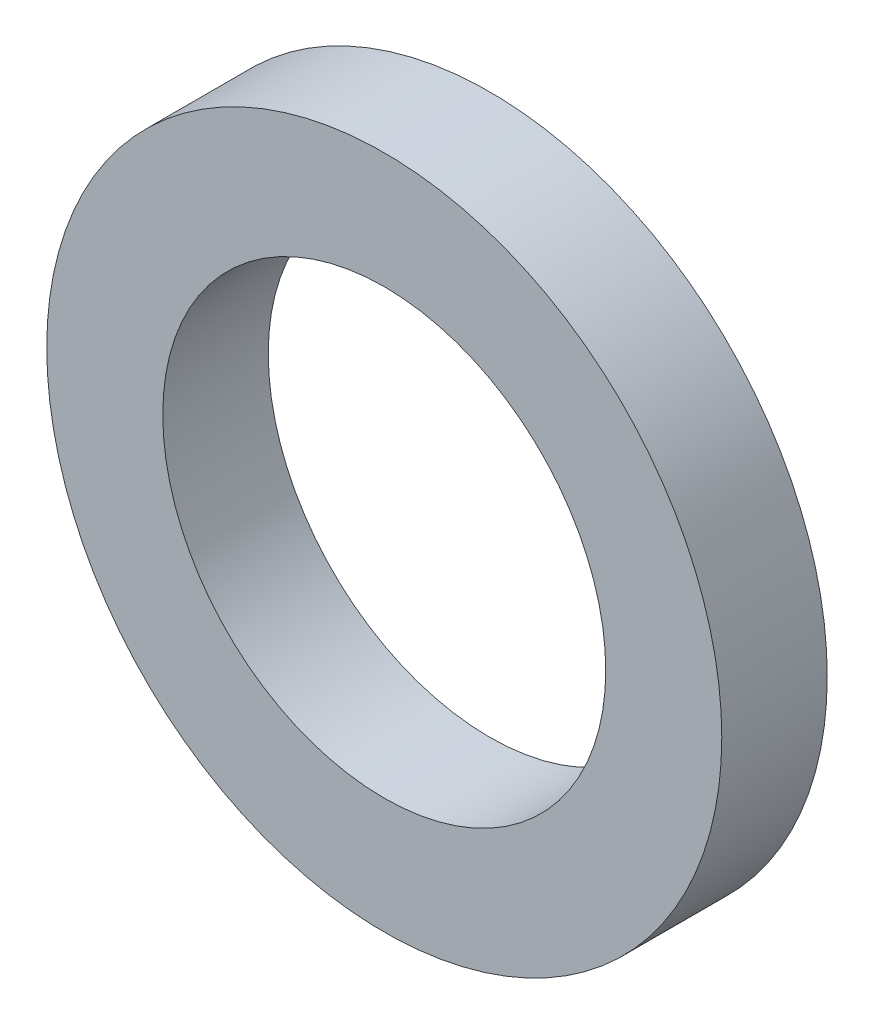
ISO-10303-21;
HEADER;
FILE_DESCRIPTION(('STEP AP214'),'2;1');
FILE_NAME('part.step','',(''),(''),'','','');
FILE_SCHEMA(('AUTOMOTIVE_DESIGN { 1 0 10303 214 1 1 1 1 }'));
ENDSEC;
DATA;
#1=APPLICATION_CONTEXT('core data for automotive mechanical design processes');
#2=APPLICATION_PROTOCOL_DEFINITION('international standard','automotive_design',2000,#1);
#3=PRODUCT_CONTEXT('',#1,'mechanical');
#4=PRODUCT('Part','Part','',(#3));
#5=PRODUCT_RELATED_PRODUCT_CATEGORY('part','',(#4));
#6=PRODUCT_DEFINITION_FORMATION('','',#4);
#7=PRODUCT_DEFINITION_CONTEXT('part definition',#1,'design');
#8=PRODUCT_DEFINITION('design','',#6,#7);
#9=PRODUCT_DEFINITION_SHAPE('','',#8);
#10=(LENGTH_UNIT() NAMED_UNIT(*) SI_UNIT(.MILLI.,.METRE.));
#11=(NAMED_UNIT(*) PLANE_ANGLE_UNIT() SI_UNIT($,.RADIAN.));
#12=(NAMED_UNIT(*) SI_UNIT($,.STERADIAN.) SOLID_ANGLE_UNIT());
#13=UNCERTAINTY_MEASURE_WITH_UNIT(LENGTH_MEASURE(1.E-05),#10,'distance_accuracy_value','');
#14=(GEOMETRIC_REPRESENTATION_CONTEXT(3) GLOBAL_UNCERTAINTY_ASSIGNED_CONTEXT((#13)) GLOBAL_UNIT_ASSIGNED_CONTEXT((#10,
#11,#12)) REPRESENTATION_CONTEXT('',''));
#15=CARTESIAN_POINT('',(0.,0.,0.));
#16=DIRECTION('',(0.,0.,1.));
#17=DIRECTION('',(1.,0.,0.));
#18=AXIS2_PLACEMENT_3D('',#15,#16,#17);
#19=CARTESIAN_POINT('',(0.,0.,1.));
#20=DIRECTION('',(0.,0.,1.));
#21=DIRECTION('',(1.,0.,0.));
#22=AXIS2_PLACEMENT_3D('',#19,#20,#21);
#23=PLANE('',#22);
#24=CARTESIAN_POINT('',(0.,0.,1.));
#25=DIRECTION('',(0.,0.,1.));
#26=DIRECTION('',(1.,0.,0.));
#27=AXIS2_PLACEMENT_3D('',#24,#25,#26);
#28=CIRCLE('',#27,3.2);
#29=CARTESIAN_POINT('',(3.2,0.,1.));
#30=VERTEX_POINT('',#29);
#31=EDGE_CURVE('E10',#30,#30,#28,.T.);
#32=ORIENTED_EDGE('',*,*,#31,.T.);
#33=EDGE_LOOP('',(#32));
#34=FACE_BOUND('',#33,.T.);
#35=CARTESIAN_POINT('',(0.,0.,1.));
#36=DIRECTION('',(0.,0.,1.));
#37=DIRECTION('',(1.,0.,0.));
#38=AXIS2_PLACEMENT_3D('',#35,#36,#37);
#39=CIRCLE('',#38,2.1);
#40=CARTESIAN_POINT('',(2.1,0.,1.));
#41=VERTEX_POINT('',#40);
#42=EDGE_CURVE('E42',#41,#41,#39,.T.);
#43=ORIENTED_EDGE('',*,*,#42,.F.);
#44=EDGE_LOOP('',(#43));
#45=FACE_BOUND('',#44,.T.);
#46=ADVANCED_FACE('F31',(#34,#45),#23,.T.);
#47=CARTESIAN_POINT('',(0.,0.,0.));
#48=DIRECTION('',(0.,0.,1.));
#49=DIRECTION('',(1.,0.,0.));
#50=AXIS2_PLACEMENT_3D('',#47,#48,#49);
#51=PLANE('',#50);
#52=CARTESIAN_POINT('',(0.,0.,0.));
#53=DIRECTION('',(0.,0.,1.));
#54=DIRECTION('',(1.,0.,0.));
#55=AXIS2_PLACEMENT_3D('',#52,#53,#54);
#56=CIRCLE('',#55,3.2);
#57=CARTESIAN_POINT('',(3.2,0.,0.));
#58=VERTEX_POINT('',#57);
#59=EDGE_CURVE('E35',#58,#58,#56,.T.);
#60=ORIENTED_EDGE('',*,*,#59,.F.);
#61=EDGE_LOOP('',(#60));
#62=FACE_BOUND('',#61,.T.);
#63=CARTESIAN_POINT('',(0.,0.,0.));
#64=DIRECTION('',(0.,0.,1.));
#65=DIRECTION('',(1.,0.,0.));
#66=AXIS2_PLACEMENT_3D('',#63,#64,#65);
#67=CIRCLE('',#66,2.1);
#68=CARTESIAN_POINT('',(2.1,0.,0.));
#69=VERTEX_POINT('',#68);
#70=EDGE_CURVE('E44',#69,#69,#67,.T.);
#71=ORIENTED_EDGE('',*,*,#70,.T.);
#72=EDGE_LOOP('',(#71));
#73=FACE_BOUND('',#72,.T.);
#74=ADVANCED_FACE('F54',(#62,#73),#51,.F.);
#75=CARTESIAN_POINT('',(0.,0.,1.));
#76=DIRECTION('',(0.,0.,-1.));
#77=DIRECTION('',(-1.,0.,0.));
#78=AXIS2_PLACEMENT_3D('',#75,#76,#77);
#79=CYLINDRICAL_SURFACE('',#78,3.2);
#80=ORIENTED_EDGE('',*,*,#31,.F.);
#81=EDGE_LOOP('',(#80));
#82=FACE_BOUND('',#81,.T.);
#83=ORIENTED_EDGE('',*,*,#59,.T.);
#84=EDGE_LOOP('',(#83));
#85=FACE_BOUND('',#84,.T.);
#86=ADVANCED_FACE('F33',(#82,#85),#79,.T.);
#87=CARTESIAN_POINT('',(0.,0.,1.));
#88=DIRECTION('',(0.,0.,-1.));
#89=DIRECTION('',(-1.,0.,0.));
#90=AXIS2_PLACEMENT_3D('',#87,#88,#89);
#91=CYLINDRICAL_SURFACE('',#90,2.1);
#92=ORIENTED_EDGE('',*,*,#42,.T.);
#93=EDGE_LOOP('',(#92));
#94=FACE_BOUND('',#93,.T.);
#95=ORIENTED_EDGE('',*,*,#70,.F.);
#96=EDGE_LOOP('',(#95));
#97=FACE_BOUND('',#96,.T.);
#98=ADVANCED_FACE('F50',(#94,#97),#91,.F.);
#99=CLOSED_SHELL('',(#46,#74,#86,#98));
#100=MANIFOLD_SOLID_BREP('B2',#99);
#101=ADVANCED_BREP_SHAPE_REPRESENTATION('',(#18,#100),#14);
#102=SHAPE_DEFINITION_REPRESENTATION(#9,#101);
ENDSEC;
END-ISO-10303-21;
